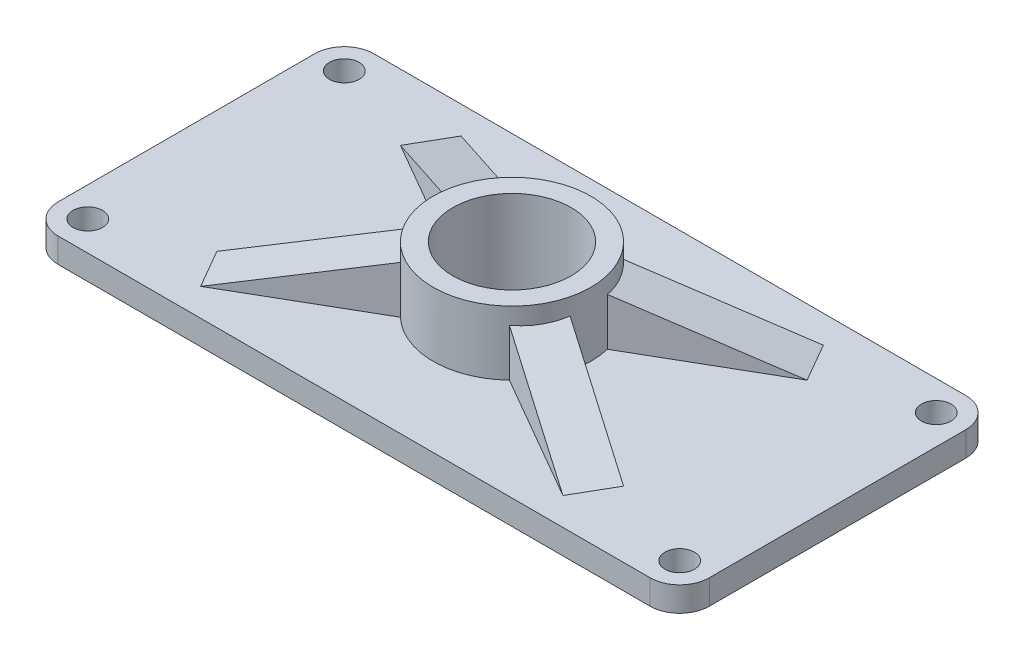
ISO-10303-21;
HEADER;
FILE_DESCRIPTION(('STEP AP214'),'2;1');
FILE_NAME('part.step','',(''),(''),'','','');
FILE_SCHEMA(('AUTOMOTIVE_DESIGN { 1 0 10303 214 1 1 1 1 }'));
ENDSEC;
DATA;
#1=APPLICATION_CONTEXT('core data for automotive mechanical design processes');
#2=APPLICATION_PROTOCOL_DEFINITION('international standard','automotive_design',2000,#1);
#3=PRODUCT_CONTEXT('',#1,'mechanical');
#4=PRODUCT('Part','Part','',(#3));
#5=PRODUCT_RELATED_PRODUCT_CATEGORY('part','',(#4));
#6=PRODUCT_DEFINITION_FORMATION('','',#4);
#7=PRODUCT_DEFINITION_CONTEXT('part definition',#1,'design');
#8=PRODUCT_DEFINITION('design','',#6,#7);
#9=PRODUCT_DEFINITION_SHAPE('','',#8);
#10=(LENGTH_UNIT() NAMED_UNIT(*) SI_UNIT(.MILLI.,.METRE.));
#11=(NAMED_UNIT(*) PLANE_ANGLE_UNIT() SI_UNIT($,.RADIAN.));
#12=(NAMED_UNIT(*) SI_UNIT($,.STERADIAN.) SOLID_ANGLE_UNIT());
#13=UNCERTAINTY_MEASURE_WITH_UNIT(LENGTH_MEASURE(1.E-05),#10,'distance_accuracy_value','');
#14=(GEOMETRIC_REPRESENTATION_CONTEXT(3) GLOBAL_UNCERTAINTY_ASSIGNED_CONTEXT((#13)) GLOBAL_UNIT_ASSIGNED_CONTEXT((#10,
#11,#12)) REPRESENTATION_CONTEXT('',''));
#15=CARTESIAN_POINT('',(0.,0.,0.));
#16=DIRECTION('',(0.,0.,1.));
#17=DIRECTION('',(1.,0.,0.));
#18=AXIS2_PLACEMENT_3D('',#15,#16,#17);
#19=CARTESIAN_POINT('',(0.,5.,0.));
#20=DIRECTION('',(0.,1.,0.));
#21=DIRECTION('',(0.,0.,1.));
#22=AXIS2_PLACEMENT_3D('',#19,#20,#21);
#23=PLANE('',#22);
#24=DIRECTION('',(-0.866025403784441,0.,-0.499999999999995));
#25=VECTOR('',#24,1.);
#26=CARTESIAN_POINT('',(-12.6423048454133,5.,-2.10288568296995));
#27=LINE('',#26,#25);
#28=CARTESIAN_POINT('',(-15.5470861469722,5.,-3.77996194936198));
#29=VERTEX_POINT('',#28);
#30=CARTESIAN_POINT('',(-41.2211431702999,5.,-18.6028856829698));
#31=VERTEX_POINT('',#30);
#32=EDGE_CURVE('E60',#29,#31,#27,.T.);
#33=ORIENTED_EDGE('',*,*,#32,.T.);
#34=DIRECTION('',(0.499999999999995,0.,-0.866025403784442));
#35=VECTOR('',#34,1.);
#36=CARTESIAN_POINT('',(-41.2211431702999,5.,-18.6028856829698));
#37=LINE('',#36,#35);
#38=CARTESIAN_POINT('',(-36.7211431702999,5.,-26.3971143170298));
#39=VERTEX_POINT('',#38);
#40=EDGE_CURVE('E64',#31,#39,#37,.T.);
#41=ORIENTED_EDGE('',*,*,#40,.T.);
#42=DIRECTION('',(-0.866025403784441,0.,-0.499999999999995));
#43=VECTOR('',#42,1.);
#44=CARTESIAN_POINT('',(-8.14230484541332,5.,-9.89711431702993));
#45=LINE('',#44,#43);
#46=CARTESIAN_POINT('',(-11.0470861469723,5.,-11.574190583422));
#47=VERTEX_POINT('',#46);
#48=EDGE_CURVE('E206',#47,#39,#45,.T.);
#49=ORIENTED_EDGE('',*,*,#48,.F.);
#50=CARTESIAN_POINT('',(0.,5.,0.));
#51=DIRECTION('',(0.,1.,0.));
#52=DIRECTION('',(0.,0.,1.));
#53=AXIS2_PLACEMENT_3D('',#50,#51,#52);
#54=CIRCLE('',#53,16.);
#55=CARTESIAN_POINT('',(11.0470861469723,5.,-11.574190583422));
#56=VERTEX_POINT('',#55);
#57=EDGE_CURVE('E254',#56,#47,#54,.T.);
#58=ORIENTED_EDGE('',*,*,#57,.F.);
#59=DIRECTION('',(-0.866025403784441,0.,0.499999999999995));
#60=VECTOR('',#59,1.);
#61=CARTESIAN_POINT('',(8.14230484541332,5.,-9.89711431702993));
#62=LINE('',#61,#60);
#63=CARTESIAN_POINT('',(36.7211431702999,5.,-26.3971143170298));
#64=VERTEX_POINT('',#63);
#65=EDGE_CURVE('E233',#64,#56,#62,.T.);
#66=ORIENTED_EDGE('',*,*,#65,.F.);
#67=DIRECTION('',(0.499999999999995,0.,0.866025403784442));
#68=VECTOR('',#67,1.);
#69=CARTESIAN_POINT('',(36.7211431702999,5.,-26.3971143170298));
#70=LINE('',#69,#68);
#71=CARTESIAN_POINT('',(41.2211431702998,5.,-18.6028856829698));
#72=VERTEX_POINT('',#71);
#73=EDGE_CURVE('E214',#64,#72,#70,.T.);
#74=ORIENTED_EDGE('',*,*,#73,.T.);
#75=DIRECTION('',(-0.866025403784441,0.,0.499999999999995));
#76=VECTOR('',#75,1.);
#77=CARTESIAN_POINT('',(12.6423048454133,5.,-2.10288568296995));
#78=LINE('',#77,#76);
#79=CARTESIAN_POINT('',(15.5470861469722,5.,-3.77996194936198));
#80=VERTEX_POINT('',#79);
#81=EDGE_CURVE('E234',#72,#80,#78,.T.);
#82=ORIENTED_EDGE('',*,*,#81,.T.);
#83=CARTESIAN_POINT('',(15.5470861469722,5.,3.77996194936198));
#84=VERTEX_POINT('',#83);
#85=EDGE_CURVE('E253',#84,#80,#54,.T.);
#86=ORIENTED_EDGE('',*,*,#85,.F.);
#87=DIRECTION('',(-0.866025403784441,0.,-0.499999999999995));
#88=VECTOR('',#87,1.);
#89=CARTESIAN_POINT('',(12.6423048454133,5.,2.10288568296995));
#90=LINE('',#89,#88);
#91=CARTESIAN_POINT('',(41.2211431702998,5.,18.6028856829698));
#92=VERTEX_POINT('',#91);
#93=EDGE_CURVE('E193',#92,#84,#90,.T.);
#94=ORIENTED_EDGE('',*,*,#93,.F.);
#95=DIRECTION('',(0.499999999999995,0.,-0.866025403784442));
#96=VECTOR('',#95,1.);
#97=CARTESIAN_POINT('',(36.7211431702999,5.,26.3971143170298));
#98=LINE('',#97,#96);
#99=CARTESIAN_POINT('',(36.7211431702999,5.,26.3971143170298));
#100=VERTEX_POINT('',#99);
#101=EDGE_CURVE('E186',#100,#92,#98,.T.);
#102=ORIENTED_EDGE('',*,*,#101,.F.);
#103=DIRECTION('',(-0.866025403784441,0.,-0.499999999999995));
#104=VECTOR('',#103,1.);
#105=CARTESIAN_POINT('',(8.14230484541332,5.,9.89711431702993));
#106=LINE('',#105,#104);
#107=CARTESIAN_POINT('',(11.0470861469723,5.,11.574190583422));
#108=VERTEX_POINT('',#107);
#109=EDGE_CURVE('E192',#100,#108,#106,.T.);
#110=ORIENTED_EDGE('',*,*,#109,.T.);
#111=CARTESIAN_POINT('',(-11.0470861469723,5.,11.574190583422));
#112=VERTEX_POINT('',#111);
#113=EDGE_CURVE('E250',#112,#108,#54,.T.);
#114=ORIENTED_EDGE('',*,*,#113,.F.);
#115=DIRECTION('',(-0.866025403784441,0.,0.499999999999995));
#116=VECTOR('',#115,1.);
#117=CARTESIAN_POINT('',(-8.14230484541332,5.,9.89711431702993));
#118=LINE('',#117,#116);
#119=CARTESIAN_POINT('',(-36.7211431702999,5.,26.3971143170298));
#120=VERTEX_POINT('',#119);
#121=EDGE_CURVE('E223',#112,#120,#118,.T.);
#122=ORIENTED_EDGE('',*,*,#121,.T.);
#123=DIRECTION('',(0.499999999999995,0.,0.866025403784442));
#124=VECTOR('',#123,1.);
#125=CARTESIAN_POINT('',(-41.2211431702999,5.,18.6028856829698));
#126=LINE('',#125,#124);
#127=CARTESIAN_POINT('',(-41.2211431702999,5.,18.6028856829698));
#128=VERTEX_POINT('',#127);
#129=EDGE_CURVE('E222',#128,#120,#126,.T.);
#130=ORIENTED_EDGE('',*,*,#129,.F.);
#131=DIRECTION('',(-0.866025403784441,0.,0.499999999999995));
#132=VECTOR('',#131,1.);
#133=CARTESIAN_POINT('',(-12.6423048454133,5.,2.10288568296995));
#134=LINE('',#133,#132);
#135=CARTESIAN_POINT('',(-15.5470861469722,5.,3.77996194936198));
#136=VERTEX_POINT('',#135);
#137=EDGE_CURVE('E215',#136,#128,#134,.T.);
#138=ORIENTED_EDGE('',*,*,#137,.F.);
#139=EDGE_CURVE('E252',#29,#136,#54,.T.);
#140=ORIENTED_EDGE('',*,*,#139,.F.);
#141=EDGE_LOOP('',(#33,#41,#49,#58,#66,#74,#82,#86,#94,#102,#110,#114,#122,#130,#138,#140));
#142=FACE_BOUND('',#141,.T.);
#143=CARTESIAN_POINT('',(-60.,5.,26.));
#144=DIRECTION('',(0.,1.,0.));
#145=DIRECTION('',(0.,0.,1.));
#146=AXIS2_PLACEMENT_3D('',#143,#144,#145);
#147=CIRCLE('',#146,3.);
#148=CARTESIAN_POINT('',(-60.,5.,29.));
#149=VERTEX_POINT('',#148);
#150=EDGE_CURVE('E255',#149,#149,#147,.T.);
#151=ORIENTED_EDGE('',*,*,#150,.F.);
#152=EDGE_LOOP('',(#151));
#153=FACE_BOUND('',#152,.T.);
#154=CARTESIAN_POINT('',(60.,5.,26.));
#155=DIRECTION('',(0.,1.,0.));
#156=DIRECTION('',(0.,0.,1.));
#157=AXIS2_PLACEMENT_3D('',#154,#155,#156);
#158=CIRCLE('',#157,3.);
#159=CARTESIAN_POINT('',(60.,5.,29.));
#160=VERTEX_POINT('',#159);
#161=EDGE_CURVE('E258',#160,#160,#158,.T.);
#162=ORIENTED_EDGE('',*,*,#161,.F.);
#163=EDGE_LOOP('',(#162));
#164=FACE_BOUND('',#163,.T.);
#165=CARTESIAN_POINT('',(60.,5.,-26.));
#166=DIRECTION('',(0.,1.,0.));
#167=DIRECTION('',(0.,0.,1.));
#168=AXIS2_PLACEMENT_3D('',#165,#166,#167);
#169=CIRCLE('',#168,3.);
#170=CARTESIAN_POINT('',(60.,5.,-23.));
#171=VERTEX_POINT('',#170);
#172=EDGE_CURVE('E261',#171,#171,#169,.T.);
#173=ORIENTED_EDGE('',*,*,#172,.F.);
#174=EDGE_LOOP('',(#173));
#175=FACE_BOUND('',#174,.T.);
#176=CARTESIAN_POINT('',(-60.,5.,-26.));
#177=DIRECTION('',(0.,1.,0.));
#178=DIRECTION('',(0.,0.,1.));
#179=AXIS2_PLACEMENT_3D('',#176,#177,#178);
#180=CIRCLE('',#179,3.);
#181=CARTESIAN_POINT('',(-60.,5.,-23.));
#182=VERTEX_POINT('',#181);
#183=EDGE_CURVE('E264',#182,#182,#180,.T.);
#184=ORIENTED_EDGE('',*,*,#183,.F.);
#185=EDGE_LOOP('',(#184));
#186=FACE_BOUND('',#185,.T.);
#187=DIRECTION('',(1.,0.,0.));
#188=VECTOR('',#187,1.);
#189=CARTESIAN_POINT('',(0.,5.,-32.));
#190=LINE('',#189,#188);
#191=CARTESIAN_POINT('',(-60.,5.,-32.));
#192=VERTEX_POINT('',#191);
#193=CARTESIAN_POINT('',(60.,5.,-32.));
#194=VERTEX_POINT('',#193);
#195=EDGE_CURVE('E267',#192,#194,#190,.T.);
#196=ORIENTED_EDGE('',*,*,#195,.F.);
#197=CARTESIAN_POINT('',(-60.,5.,-26.));
#198=DIRECTION('',(0.,1.,0.));
#199=DIRECTION('',(0.,0.,1.));
#200=AXIS2_PLACEMENT_3D('',#197,#198,#199);
#201=CIRCLE('',#200,6.);
#202=CARTESIAN_POINT('',(-66.,5.,-26.));
#203=VERTEX_POINT('',#202);
#204=EDGE_CURVE('E270',#192,#203,#201,.T.);
#205=ORIENTED_EDGE('',*,*,#204,.T.);
#206=DIRECTION('',(0.,0.,1.));
#207=VECTOR('',#206,1.);
#208=CARTESIAN_POINT('',(-66.,5.,0.));
#209=LINE('',#208,#207);
#210=CARTESIAN_POINT('',(-66.,5.,26.));
#211=VERTEX_POINT('',#210);
#212=EDGE_CURVE('E273',#203,#211,#209,.T.);
#213=ORIENTED_EDGE('',*,*,#212,.T.);
#214=CARTESIAN_POINT('',(-60.,5.,26.));
#215=DIRECTION('',(0.,1.,0.));
#216=DIRECTION('',(0.,0.,1.));
#217=AXIS2_PLACEMENT_3D('',#214,#215,#216);
#218=CIRCLE('',#217,6.);
#219=CARTESIAN_POINT('',(-60.,5.,32.));
#220=VERTEX_POINT('',#219);
#221=EDGE_CURVE('E276',#211,#220,#218,.T.);
#222=ORIENTED_EDGE('',*,*,#221,.T.);
#223=DIRECTION('',(1.,0.,0.));
#224=VECTOR('',#223,1.);
#225=CARTESIAN_POINT('',(0.,5.,32.));
#226=LINE('',#225,#224);
#227=CARTESIAN_POINT('',(60.,5.,32.));
#228=VERTEX_POINT('',#227);
#229=EDGE_CURVE('E279',#220,#228,#226,.T.);
#230=ORIENTED_EDGE('',*,*,#229,.T.);
#231=CARTESIAN_POINT('',(60.,5.,26.));
#232=DIRECTION('',(0.,1.,0.));
#233=DIRECTION('',(0.,0.,1.));
#234=AXIS2_PLACEMENT_3D('',#231,#232,#233);
#235=CIRCLE('',#234,6.);
#236=CARTESIAN_POINT('',(66.,5.,26.));
#237=VERTEX_POINT('',#236);
#238=EDGE_CURVE('E282',#228,#237,#235,.T.);
#239=ORIENTED_EDGE('',*,*,#238,.T.);
#240=DIRECTION('',(0.,0.,1.));
#241=VECTOR('',#240,1.);
#242=CARTESIAN_POINT('',(66.,5.,0.));
#243=LINE('',#242,#241);
#244=CARTESIAN_POINT('',(66.,5.,-26.));
#245=VERTEX_POINT('',#244);
#246=EDGE_CURVE('E284',#245,#237,#243,.T.);
#247=ORIENTED_EDGE('',*,*,#246,.F.);
#248=CARTESIAN_POINT('',(60.,5.,-26.));
#249=DIRECTION('',(0.,1.,0.));
#250=DIRECTION('',(0.,0.,1.));
#251=AXIS2_PLACEMENT_3D('',#248,#249,#250);
#252=CIRCLE('',#251,6.);
#253=EDGE_CURVE('E287',#194,#245,#252,.F.);
#254=ORIENTED_EDGE('',*,*,#253,.F.);
#255=EDGE_LOOP('',(#196,#205,#213,#222,#230,#239,#247,#254));
#256=FACE_BOUND('',#255,.T.);
#257=ADVANCED_FACE('F45',(#142,#153,#164,#175,#186,#256),#23,.T.);
#258=CARTESIAN_POINT('',(0.,18.,0.));
#259=DIRECTION('',(0.,-1.,0.));
#260=DIRECTION('',(0.,0.,-1.));
#261=AXIS2_PLACEMENT_3D('',#258,#259,#260);
#262=CYLINDRICAL_SURFACE('',#261,16.);
#263=CARTESIAN_POINT('',(0.,18.,0.));
#264=DIRECTION('',(0.,1.,0.));
#265=DIRECTION('',(0.,0.,1.));
#266=AXIS2_PLACEMENT_3D('',#263,#264,#265);
#267=CIRCLE('',#266,16.);
#268=CARTESIAN_POINT('',(0.,18.,16.));
#269=VERTEX_POINT('',#268);
#270=EDGE_CURVE('E244',#269,#269,#267,.T.);
#271=ORIENTED_EDGE('',*,*,#270,.F.);
#272=EDGE_LOOP('',(#271));
#273=FACE_BOUND('',#272,.T.);
#274=CARTESIAN_POINT('',(0.,19.6213863304805,0.));
#275=DIRECTION('',(-0.267616567329813,0.951056516295155,-0.154508497187469));
#276=DIRECTION('',(-0.823639103546337,-0.309016994374941,-0.475528258147573));
#277=AXIS2_PLACEMENT_3D('',#274,#275,#276);
#278=ELLIPSE('',#277,16.8233955878122,16.);
#279=CARTESIAN_POINT('',(-11.0470861469723,14.6325197536147,-11.574190583422));
#280=VERTEX_POINT('',#279);
#281=CARTESIAN_POINT('',(-15.5470861469722,14.6325197536147,-3.77996194936198));
#282=VERTEX_POINT('',#281);
#283=EDGE_CURVE('E212',#280,#282,#278,.T.);
#284=ORIENTED_EDGE('',*,*,#283,.T.);
#285=DIRECTION('',(0.,-1.,0.));
#286=VECTOR('',#285,1.);
#287=CARTESIAN_POINT('',(-15.5470861469722,18.,-3.77996194936198));
#288=LINE('',#287,#286);
#289=EDGE_CURVE('E11',#282,#29,#288,.T.);
#290=ORIENTED_EDGE('',*,*,#289,.T.);
#291=ORIENTED_EDGE('',*,*,#139,.T.);
#292=DIRECTION('',(0.,-1.,0.));
#293=VECTOR('',#292,1.);
#294=CARTESIAN_POINT('',(-15.5470861469722,18.,3.77996194936198));
#295=LINE('',#294,#293);
#296=CARTESIAN_POINT('',(-15.5470861469722,14.6325197536147,3.77996194936198));
#297=VERTEX_POINT('',#296);
#298=EDGE_CURVE('E359',#136,#297,#295,.F.);
#299=ORIENTED_EDGE('',*,*,#298,.T.);
#300=CARTESIAN_POINT('',(0.,19.6213863304805,0.));
#301=DIRECTION('',(0.267616567329813,-0.951056516295155,-0.154508497187469));
#302=DIRECTION('',(-0.823639103546337,-0.309016994374941,0.475528258147573));
#303=AXIS2_PLACEMENT_3D('',#300,#301,#302);
#304=ELLIPSE('',#303,16.8233955878122,16.);
#305=CARTESIAN_POINT('',(-11.0470861469723,14.6325197536147,11.574190583422));
#306=VERTEX_POINT('',#305);
#307=EDGE_CURVE('E356',#306,#297,#304,.T.);
#308=ORIENTED_EDGE('',*,*,#307,.F.);
#309=DIRECTION('',(0.,-1.,0.));
#310=VECTOR('',#309,1.);
#311=CARTESIAN_POINT('',(-11.0470861469723,18.,11.574190583422));
#312=LINE('',#311,#310);
#313=EDGE_CURVE('E353',#112,#306,#312,.F.);
#314=ORIENTED_EDGE('',*,*,#313,.F.);
#315=ORIENTED_EDGE('',*,*,#113,.T.);
#316=DIRECTION('',(0.,-1.,0.));
#317=VECTOR('',#316,1.);
#318=CARTESIAN_POINT('',(11.0470861469723,18.,11.574190583422));
#319=LINE('',#318,#317);
#320=CARTESIAN_POINT('',(11.0470861469723,14.6325197536147,11.574190583422));
#321=VERTEX_POINT('',#320);
#322=EDGE_CURVE('E197',#321,#108,#319,.T.);
#323=ORIENTED_EDGE('',*,*,#322,.F.);
#324=CARTESIAN_POINT('',(0.,19.6213863304805,0.));
#325=DIRECTION('',(0.267616567329813,0.951056516295156,0.154508497187469));
#326=DIRECTION('',(0.823639103546337,-0.309016994374941,0.475528258147573));
#327=AXIS2_PLACEMENT_3D('',#324,#325,#326);
#328=ELLIPSE('',#327,16.8233955878122,16.);
#329=CARTESIAN_POINT('',(15.5470861469722,14.6325197536147,3.77996194936198));
#330=VERTEX_POINT('',#329);
#331=EDGE_CURVE('E189',#321,#330,#328,.T.);
#332=ORIENTED_EDGE('',*,*,#331,.T.);
#333=DIRECTION('',(0.,-1.,0.));
#334=VECTOR('',#333,1.);
#335=CARTESIAN_POINT('',(15.5470861469722,18.,3.77996194936198));
#336=LINE('',#335,#334);
#337=EDGE_CURVE('E361',#330,#84,#336,.T.);
#338=ORIENTED_EDGE('',*,*,#337,.T.);
#339=ORIENTED_EDGE('',*,*,#85,.T.);
#340=DIRECTION('',(0.,-1.,0.));
#341=VECTOR('',#340,1.);
#342=CARTESIAN_POINT('',(15.5470861469722,18.,-3.77996194936198));
#343=LINE('',#342,#341);
#344=CARTESIAN_POINT('',(15.5470861469722,14.6325197536147,-3.77996194936198));
#345=VERTEX_POINT('',#344);
#346=EDGE_CURVE('E345',#80,#345,#343,.F.);
#347=ORIENTED_EDGE('',*,*,#346,.T.);
#348=CARTESIAN_POINT('',(0.,19.6213863304805,0.));
#349=DIRECTION('',(-0.267616567329813,-0.951056516295156,0.154508497187469));
#350=DIRECTION('',(0.823639103546337,-0.309016994374941,-0.475528258147573));
#351=AXIS2_PLACEMENT_3D('',#348,#349,#350);
#352=ELLIPSE('',#351,16.8233955878122,16.);
#353=CARTESIAN_POINT('',(11.0470861469723,14.6325197536147,-11.574190583422));
#354=VERTEX_POINT('',#353);
#355=EDGE_CURVE('E348',#354,#345,#352,.T.);
#356=ORIENTED_EDGE('',*,*,#355,.F.);
#357=DIRECTION('',(0.,-1.,0.));
#358=VECTOR('',#357,1.);
#359=CARTESIAN_POINT('',(11.0470861469723,18.,-11.574190583422));
#360=LINE('',#359,#358);
#361=EDGE_CURVE('E351',#56,#354,#360,.F.);
#362=ORIENTED_EDGE('',*,*,#361,.F.);
#363=ORIENTED_EDGE('',*,*,#57,.T.);
#364=DIRECTION('',(0.,-1.,0.));
#365=VECTOR('',#364,1.);
#366=CARTESIAN_POINT('',(-11.0470861469723,18.,-11.574190583422));
#367=LINE('',#366,#365);
#368=EDGE_CURVE('E53',#280,#47,#367,.T.);
#369=ORIENTED_EDGE('',*,*,#368,.F.);
#370=EDGE_LOOP('',(#284,#290,#291,#299,#308,#314,#315,#323,#332,#338,#339,#347,#356,#362,#363,#369));
#371=FACE_BOUND('',#370,.T.);
#372=ADVANCED_FACE('F370',(#273,#371),#262,.T.);
#373=CARTESIAN_POINT('',(0.,5.,-32.));
#374=DIRECTION('',(0.,0.,-1.));
#375=DIRECTION('',(-1.,0.,0.));
#376=AXIS2_PLACEMENT_3D('',#373,#374,#375);
#377=PLANE('',#376);
#378=DIRECTION('',(1.,0.,0.));
#379=VECTOR('',#378,1.);
#380=CARTESIAN_POINT('',(0.,0.,-32.));
#381=LINE('',#380,#379);
#382=CARTESIAN_POINT('',(-60.,0.,-32.));
#383=VERTEX_POINT('',#382);
#384=CARTESIAN_POINT('',(60.,0.,-32.));
#385=VERTEX_POINT('',#384);
#386=EDGE_CURVE('E302',#383,#385,#381,.T.);
#387=ORIENTED_EDGE('',*,*,#386,.F.);
#388=DIRECTION('',(0.,-1.,0.));
#389=VECTOR('',#388,1.);
#390=CARTESIAN_POINT('',(-60.,5.,-32.));
#391=LINE('',#390,#389);
#392=EDGE_CURVE('E343',#192,#383,#391,.T.);
#393=ORIENTED_EDGE('',*,*,#392,.F.);
#394=ORIENTED_EDGE('',*,*,#195,.T.);
#395=DIRECTION('',(0.,-1.,0.));
#396=VECTOR('',#395,1.);
#397=CARTESIAN_POINT('',(60.,5.,-32.));
#398=LINE('',#397,#396);
#399=EDGE_CURVE('E290',#194,#385,#398,.T.);
#400=ORIENTED_EDGE('',*,*,#399,.T.);
#401=EDGE_LOOP('',(#387,#393,#394,#400));
#402=FACE_BOUND('',#401,.T.);
#403=ADVANCED_FACE('F414',(#402),#377,.T.);
#404=CARTESIAN_POINT('',(-60.,5.,-26.));
#405=DIRECTION('',(0.,-1.,0.));
#406=DIRECTION('',(0.,0.,-1.));
#407=AXIS2_PLACEMENT_3D('',#404,#405,#406);
#408=CYLINDRICAL_SURFACE('',#407,6.);
#409=CARTESIAN_POINT('',(-60.,0.,-26.));
#410=DIRECTION('',(0.,1.,0.));
#411=DIRECTION('',(0.,0.,1.));
#412=AXIS2_PLACEMENT_3D('',#409,#410,#411);
#413=CIRCLE('',#412,6.);
#414=CARTESIAN_POINT('',(-66.,0.,-26.));
#415=VERTEX_POINT('',#414);
#416=EDGE_CURVE('E305',#383,#415,#413,.T.);
#417=ORIENTED_EDGE('',*,*,#416,.T.);
#418=DIRECTION('',(0.,-1.,0.));
#419=VECTOR('',#418,1.);
#420=CARTESIAN_POINT('',(-66.,5.,-26.));
#421=LINE('',#420,#419);
#422=EDGE_CURVE('E340',#203,#415,#421,.T.);
#423=ORIENTED_EDGE('',*,*,#422,.F.);
#424=ORIENTED_EDGE('',*,*,#204,.F.);
#425=ORIENTED_EDGE('',*,*,#392,.T.);
#426=EDGE_LOOP('',(#417,#423,#424,#425));
#427=FACE_BOUND('',#426,.T.);
#428=ADVANCED_FACE('F448',(#427),#408,.T.);
#429=CARTESIAN_POINT('',(-66.,5.,0.));
#430=DIRECTION('',(1.,0.,0.));
#431=DIRECTION('',(0.,0.,-1.));
#432=AXIS2_PLACEMENT_3D('',#429,#430,#431);
#433=PLANE('',#432);
#434=DIRECTION('',(0.,0.,1.));
#435=VECTOR('',#434,1.);
#436=CARTESIAN_POINT('',(-66.,0.,0.));
#437=LINE('',#436,#435);
#438=CARTESIAN_POINT('',(-66.,0.,26.));
#439=VERTEX_POINT('',#438);
#440=EDGE_CURVE('E308',#415,#439,#437,.T.);
#441=ORIENTED_EDGE('',*,*,#440,.T.);
#442=DIRECTION('',(0.,-1.,0.));
#443=VECTOR('',#442,1.);
#444=CARTESIAN_POINT('',(-66.,5.,26.));
#445=LINE('',#444,#443);
#446=EDGE_CURVE('E337',#211,#439,#445,.T.);
#447=ORIENTED_EDGE('',*,*,#446,.F.);
#448=ORIENTED_EDGE('',*,*,#212,.F.);
#449=ORIENTED_EDGE('',*,*,#422,.T.);
#450=EDGE_LOOP('',(#441,#447,#448,#449));
#451=FACE_BOUND('',#450,.T.);
#452=ADVANCED_FACE('F444',(#451),#433,.F.);
#453=CARTESIAN_POINT('',(-60.,5.,26.));
#454=DIRECTION('',(0.,-1.,0.));
#455=DIRECTION('',(0.,0.,-1.));
#456=AXIS2_PLACEMENT_3D('',#453,#454,#455);
#457=CYLINDRICAL_SURFACE('',#456,6.);
#458=CARTESIAN_POINT('',(-60.,0.,26.));
#459=DIRECTION('',(0.,1.,0.));
#460=DIRECTION('',(0.,0.,1.));
#461=AXIS2_PLACEMENT_3D('',#458,#459,#460);
#462=CIRCLE('',#461,6.);
#463=CARTESIAN_POINT('',(-60.,0.,32.));
#464=VERTEX_POINT('',#463);
#465=EDGE_CURVE('E311',#439,#464,#462,.T.);
#466=ORIENTED_EDGE('',*,*,#465,.T.);
#467=DIRECTION('',(0.,-1.,0.));
#468=VECTOR('',#467,1.);
#469=CARTESIAN_POINT('',(-60.,5.,32.));
#470=LINE('',#469,#468);
#471=EDGE_CURVE('E334',#220,#464,#470,.T.);
#472=ORIENTED_EDGE('',*,*,#471,.F.);
#473=ORIENTED_EDGE('',*,*,#221,.F.);
#474=ORIENTED_EDGE('',*,*,#446,.T.);
#475=EDGE_LOOP('',(#466,#472,#473,#474));
#476=FACE_BOUND('',#475,.T.);
#477=ADVANCED_FACE('F440',(#476),#457,.T.);
#478=CARTESIAN_POINT('',(0.,5.,32.));
#479=DIRECTION('',(0.,0.,-1.));
#480=DIRECTION('',(-1.,0.,0.));
#481=AXIS2_PLACEMENT_3D('',#478,#479,#480);
#482=PLANE('',#481);
#483=DIRECTION('',(1.,0.,0.));
#484=VECTOR('',#483,1.);
#485=CARTESIAN_POINT('',(0.,0.,32.));
#486=LINE('',#485,#484);
#487=CARTESIAN_POINT('',(60.,0.,32.));
#488=VERTEX_POINT('',#487);
#489=EDGE_CURVE('E314',#464,#488,#486,.T.);
#490=ORIENTED_EDGE('',*,*,#489,.T.);
#491=DIRECTION('',(0.,-1.,0.));
#492=VECTOR('',#491,1.);
#493=CARTESIAN_POINT('',(60.,5.,32.));
#494=LINE('',#493,#492);
#495=EDGE_CURVE('E331',#228,#488,#494,.T.);
#496=ORIENTED_EDGE('',*,*,#495,.F.);
#497=ORIENTED_EDGE('',*,*,#229,.F.);
#498=ORIENTED_EDGE('',*,*,#471,.T.);
#499=EDGE_LOOP('',(#490,#496,#497,#498));
#500=FACE_BOUND('',#499,.T.);
#501=ADVANCED_FACE('F436',(#500),#482,.F.);
#502=CARTESIAN_POINT('',(60.,5.,26.));
#503=DIRECTION('',(0.,-1.,0.));
#504=DIRECTION('',(0.,0.,-1.));
#505=AXIS2_PLACEMENT_3D('',#502,#503,#504);
#506=CYLINDRICAL_SURFACE('',#505,6.);
#507=CARTESIAN_POINT('',(60.,0.,26.));
#508=DIRECTION('',(0.,1.,0.));
#509=DIRECTION('',(0.,0.,1.));
#510=AXIS2_PLACEMENT_3D('',#507,#508,#509);
#511=CIRCLE('',#510,6.);
#512=CARTESIAN_POINT('',(66.,0.,26.));
#513=VERTEX_POINT('',#512);
#514=EDGE_CURVE('E317',#488,#513,#511,.T.);
#515=ORIENTED_EDGE('',*,*,#514,.T.);
#516=DIRECTION('',(0.,-1.,0.));
#517=VECTOR('',#516,1.);
#518=CARTESIAN_POINT('',(66.,5.,26.));
#519=LINE('',#518,#517);
#520=EDGE_CURVE('E329',#237,#513,#519,.T.);
#521=ORIENTED_EDGE('',*,*,#520,.F.);
#522=ORIENTED_EDGE('',*,*,#238,.F.);
#523=ORIENTED_EDGE('',*,*,#495,.T.);
#524=EDGE_LOOP('',(#515,#521,#522,#523));
#525=FACE_BOUND('',#524,.T.);
#526=ADVANCED_FACE('F432',(#525),#506,.T.);
#527=CARTESIAN_POINT('',(66.,5.,0.));
#528=DIRECTION('',(1.,0.,0.));
#529=DIRECTION('',(0.,0.,-1.));
#530=AXIS2_PLACEMENT_3D('',#527,#528,#529);
#531=PLANE('',#530);
#532=DIRECTION('',(0.,0.,1.));
#533=VECTOR('',#532,1.);
#534=CARTESIAN_POINT('',(66.,0.,0.));
#535=LINE('',#534,#533);
#536=CARTESIAN_POINT('',(66.,0.,-26.));
#537=VERTEX_POINT('',#536);
#538=EDGE_CURVE('E320',#537,#513,#535,.T.);
#539=ORIENTED_EDGE('',*,*,#538,.F.);
#540=DIRECTION('',(0.,-1.,0.));
#541=VECTOR('',#540,1.);
#542=CARTESIAN_POINT('',(66.,5.,-26.));
#543=LINE('',#542,#541);
#544=EDGE_CURVE('E327',#245,#537,#543,.T.);
#545=ORIENTED_EDGE('',*,*,#544,.F.);
#546=ORIENTED_EDGE('',*,*,#246,.T.);
#547=ORIENTED_EDGE('',*,*,#520,.T.);
#548=EDGE_LOOP('',(#539,#545,#546,#547));
#549=FACE_BOUND('',#548,.T.);
#550=ADVANCED_FACE('F428',(#549),#531,.T.);
#551=CARTESIAN_POINT('',(-60.,5.,-26.));
#552=DIRECTION('',(0.,-1.,0.));
#553=DIRECTION('',(0.,0.,-1.));
#554=AXIS2_PLACEMENT_3D('',#551,#552,#553);
#555=CYLINDRICAL_SURFACE('',#554,3.);
#556=ORIENTED_EDGE('',*,*,#183,.T.);
#557=EDGE_LOOP('',(#556));
#558=FACE_BOUND('',#557,.T.);
#559=CARTESIAN_POINT('',(-60.,0.,-26.));
#560=DIRECTION('',(0.,1.,0.));
#561=DIRECTION('',(0.,0.,1.));
#562=AXIS2_PLACEMENT_3D('',#559,#560,#561);
#563=CIRCLE('',#562,3.);
#564=CARTESIAN_POINT('',(-60.,0.,-23.));
#565=VERTEX_POINT('',#564);
#566=EDGE_CURVE('E299',#565,#565,#563,.T.);
#567=ORIENTED_EDGE('',*,*,#566,.F.);
#568=EDGE_LOOP('',(#567));
#569=FACE_BOUND('',#568,.T.);
#570=ADVANCED_FACE('F431',(#558,#569),#555,.F.);
#571=CARTESIAN_POINT('',(60.,5.,-26.));
#572=DIRECTION('',(0.,-1.,0.));
#573=DIRECTION('',(0.,0.,-1.));
#574=AXIS2_PLACEMENT_3D('',#571,#572,#573);
#575=CYLINDRICAL_SURFACE('',#574,3.);
#576=ORIENTED_EDGE('',*,*,#172,.T.);
#577=EDGE_LOOP('',(#576));
#578=FACE_BOUND('',#577,.T.);
#579=CARTESIAN_POINT('',(60.,0.,-26.));
#580=DIRECTION('',(0.,1.,0.));
#581=DIRECTION('',(0.,0.,1.));
#582=AXIS2_PLACEMENT_3D('',#579,#580,#581);
#583=CIRCLE('',#582,3.);
#584=CARTESIAN_POINT('',(60.,0.,-23.));
#585=VERTEX_POINT('',#584);
#586=EDGE_CURVE('E296',#585,#585,#583,.T.);
#587=ORIENTED_EDGE('',*,*,#586,.F.);
#588=EDGE_LOOP('',(#587));
#589=FACE_BOUND('',#588,.T.);
#590=ADVANCED_FACE('F458',(#578,#589),#575,.F.);
#591=CARTESIAN_POINT('',(60.,5.,26.));
#592=DIRECTION('',(0.,-1.,0.));
#593=DIRECTION('',(0.,0.,-1.));
#594=AXIS2_PLACEMENT_3D('',#591,#592,#593);
#595=CYLINDRICAL_SURFACE('',#594,3.);
#596=ORIENTED_EDGE('',*,*,#161,.T.);
#597=EDGE_LOOP('',(#596));
#598=FACE_BOUND('',#597,.T.);
#599=CARTESIAN_POINT('',(60.,0.,26.));
#600=DIRECTION('',(0.,1.,0.));
#601=DIRECTION('',(0.,0.,1.));
#602=AXIS2_PLACEMENT_3D('',#599,#600,#601);
#603=CIRCLE('',#602,3.);
#604=CARTESIAN_POINT('',(60.,0.,29.));
#605=VERTEX_POINT('',#604);
#606=EDGE_CURVE('E293',#605,#605,#603,.T.);
#607=ORIENTED_EDGE('',*,*,#606,.F.);
#608=EDGE_LOOP('',(#607));
#609=FACE_BOUND('',#608,.T.);
#610=ADVANCED_FACE('F461',(#598,#609),#595,.F.);
#611=CARTESIAN_POINT('',(-60.,5.,26.));
#612=DIRECTION('',(0.,-1.,0.));
#613=DIRECTION('',(0.,0.,-1.));
#614=AXIS2_PLACEMENT_3D('',#611,#612,#613);
#615=CYLINDRICAL_SURFACE('',#614,3.);
#616=ORIENTED_EDGE('',*,*,#150,.T.);
#617=EDGE_LOOP('',(#616));
#618=FACE_BOUND('',#617,.T.);
#619=CARTESIAN_POINT('',(-60.,0.,26.));
#620=DIRECTION('',(0.,1.,0.));
#621=DIRECTION('',(0.,0.,1.));
#622=AXIS2_PLACEMENT_3D('',#619,#620,#621);
#623=CIRCLE('',#622,3.);
#624=CARTESIAN_POINT('',(-60.,0.,29.));
#625=VERTEX_POINT('',#624);
#626=EDGE_CURVE('E247',#625,#625,#623,.T.);
#627=ORIENTED_EDGE('',*,*,#626,.F.);
#628=EDGE_LOOP('',(#627));
#629=FACE_BOUND('',#628,.T.);
#630=ADVANCED_FACE('F47',(#618,#629),#615,.F.);
#631=CARTESIAN_POINT('',(60.,5.,-26.));
#632=DIRECTION('',(0.,-1.,0.));
#633=DIRECTION('',(0.,0.,-1.));
#634=AXIS2_PLACEMENT_3D('',#631,#632,#633);
#635=CYLINDRICAL_SURFACE('',#634,6.);
#636=CARTESIAN_POINT('',(60.,0.,-26.));
#637=DIRECTION('',(0.,1.,0.));
#638=DIRECTION('',(0.,0.,1.));
#639=AXIS2_PLACEMENT_3D('',#636,#637,#638);
#640=CIRCLE('',#639,6.);
#641=EDGE_CURVE('E323',#385,#537,#640,.F.);
#642=ORIENTED_EDGE('',*,*,#641,.F.);
#643=ORIENTED_EDGE('',*,*,#399,.F.);
#644=ORIENTED_EDGE('',*,*,#253,.T.);
#645=ORIENTED_EDGE('',*,*,#544,.T.);
#646=EDGE_LOOP('',(#642,#643,#644,#645));
#647=FACE_BOUND('',#646,.T.);
#648=ADVANCED_FACE('F423',(#647),#635,.T.);
#649=CARTESIAN_POINT('',(0.,0.,0.));
#650=DIRECTION('',(0.,1.,0.));
#651=DIRECTION('',(0.,0.,1.));
#652=AXIS2_PLACEMENT_3D('',#649,#650,#651);
#653=PLANE('',#652);
#654=ORIENTED_EDGE('',*,*,#626,.T.);
#655=EDGE_LOOP('',(#654));
#656=FACE_BOUND('',#655,.T.);
#657=ORIENTED_EDGE('',*,*,#606,.T.);
#658=EDGE_LOOP('',(#657));
#659=FACE_BOUND('',#658,.T.);
#660=ORIENTED_EDGE('',*,*,#586,.T.);
#661=EDGE_LOOP('',(#660));
#662=FACE_BOUND('',#661,.T.);
#663=ORIENTED_EDGE('',*,*,#566,.T.);
#664=EDGE_LOOP('',(#663));
#665=FACE_BOUND('',#664,.T.);
#666=ORIENTED_EDGE('',*,*,#386,.T.);
#667=ORIENTED_EDGE('',*,*,#641,.T.);
#668=ORIENTED_EDGE('',*,*,#538,.T.);
#669=ORIENTED_EDGE('',*,*,#514,.F.);
#670=ORIENTED_EDGE('',*,*,#489,.F.);
#671=ORIENTED_EDGE('',*,*,#465,.F.);
#672=ORIENTED_EDGE('',*,*,#440,.F.);
#673=ORIENTED_EDGE('',*,*,#416,.F.);
#674=EDGE_LOOP('',(#666,#667,#668,#669,#670,#671,#672,#673));
#675=FACE_BOUND('',#674,.T.);
#676=CARTESIAN_POINT('',(0.,0.,0.));
#677=DIRECTION('',(0.,1.,0.));
#678=DIRECTION('',(0.,0.,1.));
#679=AXIS2_PLACEMENT_3D('',#676,#677,#678);
#680=CIRCLE('',#679,12.);
#681=CARTESIAN_POINT('',(0.,0.,12.));
#682=VERTEX_POINT('',#681);
#683=EDGE_CURVE('E230',#682,#682,#680,.T.);
#684=ORIENTED_EDGE('',*,*,#683,.T.);
#685=EDGE_LOOP('',(#684));
#686=FACE_BOUND('',#685,.T.);
#687=ADVANCED_FACE('F420',(#656,#659,#662,#665,#675,#686),#653,.F.);
#688=CARTESIAN_POINT('',(0.,18.,0.));
#689=DIRECTION('',(0.,-1.,0.));
#690=DIRECTION('',(0.,0.,-1.));
#691=AXIS2_PLACEMENT_3D('',#688,#689,#690);
#692=CYLINDRICAL_SURFACE('',#691,12.);
#693=CARTESIAN_POINT('',(0.,18.,0.));
#694=DIRECTION('',(0.,1.,0.));
#695=DIRECTION('',(0.,0.,1.));
#696=AXIS2_PLACEMENT_3D('',#693,#694,#695);
#697=CIRCLE('',#696,12.);
#698=CARTESIAN_POINT('',(0.,18.,12.));
#699=VERTEX_POINT('',#698);
#700=EDGE_CURVE('E241',#699,#699,#697,.T.);
#701=ORIENTED_EDGE('',*,*,#700,.T.);
#702=EDGE_LOOP('',(#701));
#703=FACE_BOUND('',#702,.T.);
#704=ORIENTED_EDGE('',*,*,#683,.F.);
#705=EDGE_LOOP('',(#704));
#706=FACE_BOUND('',#705,.T.);
#707=ADVANCED_FACE('F419',(#703,#706),#692,.F.);
#708=CARTESIAN_POINT('',(0.,18.,0.));
#709=DIRECTION('',(0.,1.,0.));
#710=DIRECTION('',(0.,0.,1.));
#711=AXIS2_PLACEMENT_3D('',#708,#709,#710);
#712=PLANE('',#711);
#713=ORIENTED_EDGE('',*,*,#700,.F.);
#714=EDGE_LOOP('',(#713));
#715=FACE_BOUND('',#714,.T.);
#716=ORIENTED_EDGE('',*,*,#270,.T.);
#717=EDGE_LOOP('',(#716));
#718=FACE_BOUND('',#717,.T.);
#719=ADVANCED_FACE('F485',(#715,#718),#712,.T.);
#720=CARTESIAN_POINT('',(-2.24999999999998,0.,-3.89711431702999));
#721=DIRECTION('',(0.499999999999995,0.,0.866025403784441));
#722=DIRECTION('',(0.866025403784442,0.,-0.499999999999995));
#723=AXIS2_PLACEMENT_3D('',#720,#721,#722);
#724=PLANE('',#723);
#725=ORIENTED_EDGE('',*,*,#65,.T.);
#726=ORIENTED_EDGE('',*,*,#361,.T.);
#727=DIRECTION('',(0.823639103546337,-0.309016994374941,-0.475528258147573));
#728=VECTOR('',#727,1.);
#729=CARTESIAN_POINT('',(36.7211431702999,5.,-26.3971143170298));
#730=LINE('',#729,#728);
#731=EDGE_CURVE('E237',#354,#64,#730,.T.);
#732=ORIENTED_EDGE('',*,*,#731,.T.);
#733=EDGE_LOOP('',(#725,#726,#732));
#734=FACE_BOUND('',#733,.T.);
#735=ADVANCED_FACE('F491',(#734),#724,.F.);
#736=CARTESIAN_POINT('',(2.24999999999998,0.,3.89711431702999));
#737=DIRECTION('',(0.499999999999995,0.,0.866025403784441));
#738=DIRECTION('',(0.866025403784442,0.,-0.499999999999995));
#739=AXIS2_PLACEMENT_3D('',#736,#737,#738);
#740=PLANE('',#739);
#741=ORIENTED_EDGE('',*,*,#346,.F.);
#742=ORIENTED_EDGE('',*,*,#81,.F.);
#743=DIRECTION('',(0.823639103546337,-0.309016994374941,-0.475528258147573));
#744=VECTOR('',#743,1.);
#745=CARTESIAN_POINT('',(41.2211431702998,5.,-18.6028856829698));
#746=LINE('',#745,#744);
#747=EDGE_CURVE('E225',#345,#72,#746,.T.);
#748=ORIENTED_EDGE('',*,*,#747,.F.);
#749=EDGE_LOOP('',(#741,#742,#748));
#750=FACE_BOUND('',#749,.T.);
#751=ADVANCED_FACE('F500',(#750),#740,.T.);
#752=CARTESIAN_POINT('',(36.7211431702999,5.,-26.3971143170298));
#753=DIRECTION('',(-0.267616567329813,-0.951056516295156,0.154508497187469));
#754=DIRECTION('',(0.962616130967098,-0.270869312403482,0.));
#755=AXIS2_PLACEMENT_3D('',#752,#753,#754);
#756=PLANE('',#755);
#757=ORIENTED_EDGE('',*,*,#731,.F.);
#758=ORIENTED_EDGE('',*,*,#355,.T.);
#759=ORIENTED_EDGE('',*,*,#747,.T.);
#760=ORIENTED_EDGE('',*,*,#73,.F.);
#761=EDGE_LOOP('',(#757,#758,#759,#760));
#762=FACE_BOUND('',#761,.T.);
#763=ADVANCED_FACE('F407',(#762),#756,.F.);
#764=CARTESIAN_POINT('',(-2.24999999999998,0.,-3.89711431702999));
#765=DIRECTION('',(-0.499999999999995,0.,-0.866025403784442));
#766=DIRECTION('',(-0.866025403784442,0.,0.499999999999995));
#767=AXIS2_PLACEMENT_3D('',#764,#765,#766);
#768=PLANE('',#767);
#769=ORIENTED_EDGE('',*,*,#298,.F.);
#770=ORIENTED_EDGE('',*,*,#137,.T.);
#771=DIRECTION('',(0.823639103546336,0.309016994374941,-0.475528258147573));
#772=VECTOR('',#771,1.);
#773=CARTESIAN_POINT('',(-41.2211431702999,5.,18.6028856829698));
#774=LINE('',#773,#772);
#775=EDGE_CURVE('E218',#128,#297,#774,.T.);
#776=ORIENTED_EDGE('',*,*,#775,.T.);
#777=EDGE_LOOP('',(#769,#770,#776));
#778=FACE_BOUND('',#777,.T.);
#779=ADVANCED_FACE('F393',(#778),#768,.T.);
#780=CARTESIAN_POINT('',(2.24999999999998,0.,3.89711431702999));
#781=DIRECTION('',(-0.499999999999995,0.,-0.866025403784442));
#782=DIRECTION('',(-0.866025403784442,0.,0.499999999999995));
#783=AXIS2_PLACEMENT_3D('',#780,#781,#782);
#784=PLANE('',#783);
#785=ORIENTED_EDGE('',*,*,#121,.F.);
#786=ORIENTED_EDGE('',*,*,#313,.T.);
#787=DIRECTION('',(0.823639103546336,0.309016994374941,-0.475528258147573));
#788=VECTOR('',#787,1.);
#789=CARTESIAN_POINT('',(-36.7211431702999,5.,26.3971143170298));
#790=LINE('',#789,#788);
#791=EDGE_CURVE('E219',#120,#306,#790,.T.);
#792=ORIENTED_EDGE('',*,*,#791,.F.);
#793=EDGE_LOOP('',(#785,#786,#792));
#794=FACE_BOUND('',#793,.T.);
#795=ADVANCED_FACE('F399',(#794),#784,.F.);
#796=CARTESIAN_POINT('',(-41.2211431702999,5.,18.6028856829698));
#797=DIRECTION('',(0.267616567329813,-0.951056516295155,-0.154508497187469));
#798=DIRECTION('',(0.962616130967098,0.270869312403483,0.));
#799=AXIS2_PLACEMENT_3D('',#796,#797,#798);
#800=PLANE('',#799);
#801=ORIENTED_EDGE('',*,*,#791,.T.);
#802=ORIENTED_EDGE('',*,*,#307,.T.);
#803=ORIENTED_EDGE('',*,*,#775,.F.);
#804=ORIENTED_EDGE('',*,*,#129,.T.);
#805=EDGE_LOOP('',(#801,#802,#803,#804));
#806=FACE_BOUND('',#805,.T.);
#807=ADVANCED_FACE('F395',(#806),#800,.F.);
#808=CARTESIAN_POINT('',(-2.24999999999998,0.,3.89711431702999));
#809=DIRECTION('',(0.499999999999995,0.,-0.866025403784441));
#810=DIRECTION('',(0.866025403784442,0.,0.499999999999995));
#811=AXIS2_PLACEMENT_3D('',#808,#809,#810);
#812=PLANE('',#811);
#813=DIRECTION('',(0.823639103546337,-0.309016994374941,0.475528258147573));
#814=VECTOR('',#813,1.);
#815=CARTESIAN_POINT('',(36.7211431702999,5.,26.3971143170298));
#816=LINE('',#815,#814);
#817=EDGE_CURVE('E181',#321,#100,#816,.T.);
#818=ORIENTED_EDGE('',*,*,#817,.F.);
#819=ORIENTED_EDGE('',*,*,#322,.T.);
#820=ORIENTED_EDGE('',*,*,#109,.F.);
#821=EDGE_LOOP('',(#818,#819,#820));
#822=FACE_BOUND('',#821,.T.);
#823=ADVANCED_FACE('F196',(#822),#812,.F.);
#824=CARTESIAN_POINT('',(2.24999999999998,0.,-3.89711431702999));
#825=DIRECTION('',(0.499999999999995,0.,-0.866025403784441));
#826=DIRECTION('',(0.866025403784442,0.,0.499999999999995));
#827=AXIS2_PLACEMENT_3D('',#824,#825,#826);
#828=PLANE('',#827);
#829=ORIENTED_EDGE('',*,*,#337,.F.);
#830=DIRECTION('',(0.823639103546337,-0.309016994374941,0.475528258147573));
#831=VECTOR('',#830,1.);
#832=CARTESIAN_POINT('',(41.2211431702998,5.,18.6028856829698));
#833=LINE('',#832,#831);
#834=EDGE_CURVE('E384',#330,#92,#833,.T.);
#835=ORIENTED_EDGE('',*,*,#834,.T.);
#836=ORIENTED_EDGE('',*,*,#93,.T.);
#837=EDGE_LOOP('',(#829,#835,#836));
#838=FACE_BOUND('',#837,.T.);
#839=ADVANCED_FACE('F386',(#838),#828,.T.);
#840=CARTESIAN_POINT('',(36.7211431702999,5.,26.3971143170298));
#841=DIRECTION('',(0.267616567329813,0.951056516295156,0.154508497187469));
#842=DIRECTION('',(-0.962616130967098,0.270869312403482,0.));
#843=AXIS2_PLACEMENT_3D('',#840,#841,#842);
#844=PLANE('',#843);
#845=ORIENTED_EDGE('',*,*,#331,.F.);
#846=ORIENTED_EDGE('',*,*,#817,.T.);
#847=ORIENTED_EDGE('',*,*,#101,.T.);
#848=ORIENTED_EDGE('',*,*,#834,.F.);
#849=EDGE_LOOP('',(#845,#846,#847,#848));
#850=FACE_BOUND('',#849,.T.);
#851=ADVANCED_FACE('F183',(#850),#844,.T.);
#852=CARTESIAN_POINT('',(-2.24999999999998,0.,3.89711431702999));
#853=DIRECTION('',(-0.499999999999995,0.,0.866025403784442));
#854=DIRECTION('',(-0.866025403784442,0.,-0.499999999999995));
#855=AXIS2_PLACEMENT_3D('',#852,#853,#854);
#856=PLANE('',#855);
#857=ORIENTED_EDGE('',*,*,#289,.F.);
#858=DIRECTION('',(0.823639103546336,0.309016994374941,0.475528258147573));
#859=VECTOR('',#858,1.);
#860=CARTESIAN_POINT('',(-41.2211431702999,5.,-18.6028856829698));
#861=LINE('',#860,#859);
#862=EDGE_CURVE('E378',#31,#282,#861,.T.);
#863=ORIENTED_EDGE('',*,*,#862,.F.);
#864=ORIENTED_EDGE('',*,*,#32,.F.);
#865=EDGE_LOOP('',(#857,#863,#864));
#866=FACE_BOUND('',#865,.T.);
#867=ADVANCED_FACE('F567',(#866),#856,.T.);
#868=CARTESIAN_POINT('',(2.24999999999998,0.,-3.89711431702999));
#869=DIRECTION('',(-0.499999999999995,0.,0.866025403784442));
#870=DIRECTION('',(-0.866025403784442,0.,-0.499999999999995));
#871=AXIS2_PLACEMENT_3D('',#868,#869,#870);
#872=PLANE('',#871);
#873=DIRECTION('',(0.823639103546336,0.309016994374941,0.475528258147573));
#874=VECTOR('',#873,1.);
#875=CARTESIAN_POINT('',(-36.7211431702999,5.,-26.3971143170298));
#876=LINE('',#875,#874);
#877=EDGE_CURVE('E203',#39,#280,#876,.T.);
#878=ORIENTED_EDGE('',*,*,#877,.T.);
#879=ORIENTED_EDGE('',*,*,#368,.T.);
#880=ORIENTED_EDGE('',*,*,#48,.T.);
#881=EDGE_LOOP('',(#878,#879,#880));
#882=FACE_BOUND('',#881,.T.);
#883=ADVANCED_FACE('F366',(#882),#872,.F.);
#884=CARTESIAN_POINT('',(-41.2211431702999,5.,-18.6028856829698));
#885=DIRECTION('',(-0.267616567329813,0.951056516295155,-0.154508497187469));
#886=DIRECTION('',(-0.962616130967098,-0.270869312403483,0.));
#887=AXIS2_PLACEMENT_3D('',#884,#885,#886);
#888=PLANE('',#887);
#889=ORIENTED_EDGE('',*,*,#283,.F.);
#890=ORIENTED_EDGE('',*,*,#877,.F.);
#891=ORIENTED_EDGE('',*,*,#40,.F.);
#892=ORIENTED_EDGE('',*,*,#862,.T.);
#893=EDGE_LOOP('',(#889,#890,#891,#892));
#894=FACE_BOUND('',#893,.T.);
#895=ADVANCED_FACE('F376',(#894),#888,.T.);
#896=CLOSED_SHELL('',(#257,#372,#403,#428,#452,#477,#501,#526,#550,#570,#590,#610,#630,#648,
#687,#707,#719,#735,#751,#763,#779,#795,#807,#823,#839,#851,#867,#883,#895));
#897=MANIFOLD_SOLID_BREP('B2',#896);
#898=ADVANCED_BREP_SHAPE_REPRESENTATION('',(#18,#897),#14);
#899=SHAPE_DEFINITION_REPRESENTATION(#9,#898);
ENDSEC;
END-ISO-10303-21;
